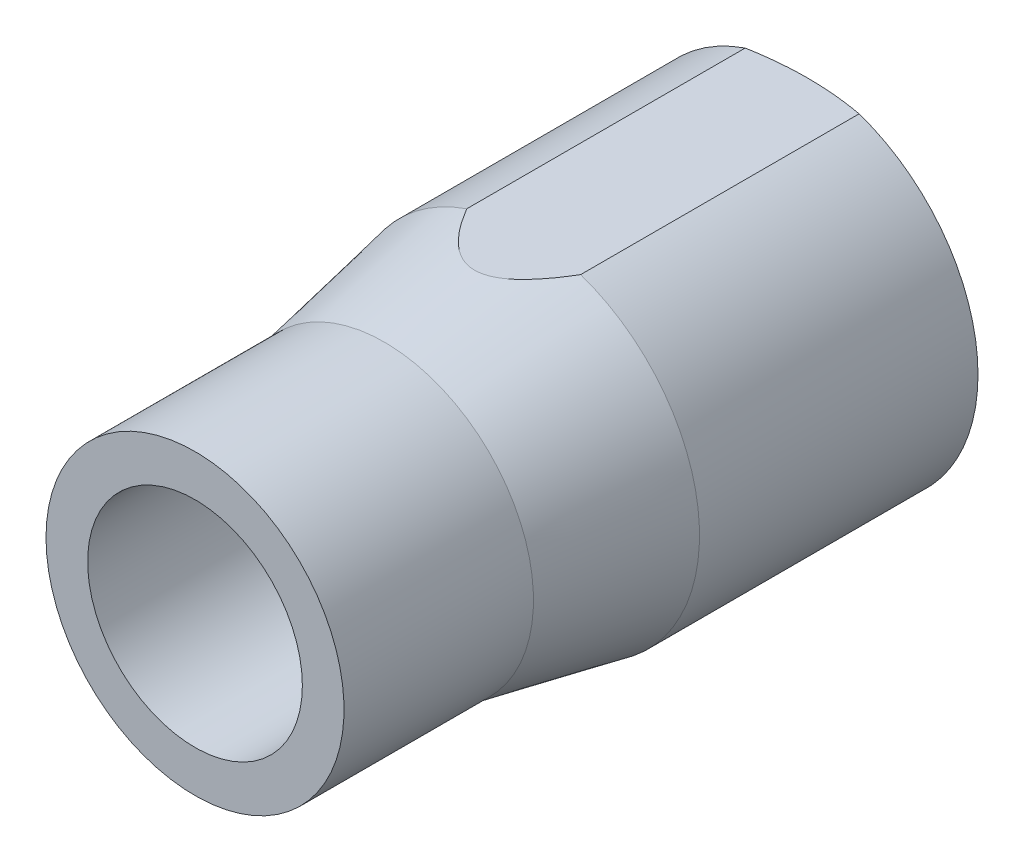
ISO-10303-21;
HEADER;
FILE_DESCRIPTION(('STEP AP214'),'2;1');
FILE_NAME('part.step','',(''),(''),'','','');
FILE_SCHEMA(('AUTOMOTIVE_DESIGN { 1 0 10303 214 1 1 1 1 }'));
ENDSEC;
DATA;
#1=APPLICATION_CONTEXT('core data for automotive mechanical design processes');
#2=APPLICATION_PROTOCOL_DEFINITION('international standard','automotive_design',2000,#1);
#3=PRODUCT_CONTEXT('',#1,'mechanical');
#4=PRODUCT('Part','Part','',(#3));
#5=PRODUCT_RELATED_PRODUCT_CATEGORY('part','',(#4));
#6=PRODUCT_DEFINITION_FORMATION('','',#4);
#7=PRODUCT_DEFINITION_CONTEXT('part definition',#1,'design');
#8=PRODUCT_DEFINITION('design','',#6,#7);
#9=PRODUCT_DEFINITION_SHAPE('','',#8);
#10=(LENGTH_UNIT() NAMED_UNIT(*) SI_UNIT(.MILLI.,.METRE.));
#11=(NAMED_UNIT(*) PLANE_ANGLE_UNIT() SI_UNIT($,.RADIAN.));
#12=(NAMED_UNIT(*) SI_UNIT($,.STERADIAN.) SOLID_ANGLE_UNIT());
#13=UNCERTAINTY_MEASURE_WITH_UNIT(LENGTH_MEASURE(1.E-05),#10,'distance_accuracy_value','');
#14=(GEOMETRIC_REPRESENTATION_CONTEXT(3) GLOBAL_UNCERTAINTY_ASSIGNED_CONTEXT((#13)) GLOBAL_UNIT_ASSIGNED_CONTEXT((#10,
#11,#12)) REPRESENTATION_CONTEXT('',''));
#15=CARTESIAN_POINT('',(0.,0.,0.));
#16=DIRECTION('',(0.,0.,1.));
#17=DIRECTION('',(1.,0.,0.));
#18=AXIS2_PLACEMENT_3D('',#15,#16,#17);
#19=CARTESIAN_POINT('',(0.,0.,13.7795));
#20=DIRECTION('',(0.,0.,-1.));
#21=DIRECTION('',(-1.,0.,0.));
#22=AXIS2_PLACEMENT_3D('',#19,#20,#21);
#23=CYLINDRICAL_SURFACE('',#22,2.06985324725674);
#24=CARTESIAN_POINT('',(0.,0.,0.));
#25=DIRECTION('',(0.,0.,-1.));
#26=DIRECTION('',(-1.,0.,0.));
#27=AXIS2_PLACEMENT_3D('',#24,#25,#26);
#28=CIRCLE('',#27,2.06985324725674);
#29=CARTESIAN_POINT('',(-2.06985324725674,0.,0.));
#30=VERTEX_POINT('',#29);
#31=EDGE_CURVE('E162',#30,#30,#28,.T.);
#32=ORIENTED_EDGE('',*,*,#31,.T.);
#33=EDGE_LOOP('',(#32));
#34=FACE_BOUND('',#33,.T.);
#35=CARTESIAN_POINT('',(0.,0.,11.3284));
#36=DIRECTION('',(0.,0.,1.));
#37=DIRECTION('',(1.,0.,0.));
#38=AXIS2_PLACEMENT_3D('',#35,#36,#37);
#39=CIRCLE('',#38,2.06985324725674);
#40=CARTESIAN_POINT('',(2.06985324725674,0.,11.3284));
#41=VERTEX_POINT('',#40);
#42=EDGE_CURVE('E43',#41,#41,#39,.F.);
#43=ORIENTED_EDGE('',*,*,#42,.F.);
#44=EDGE_LOOP('',(#43));
#45=FACE_BOUND('',#44,.T.);
#46=ADVANCED_FACE('F38',(#34,#45),#23,.F.);
#47=CARTESIAN_POINT('',(0.,0.,9.7155));
#48=DIRECTION('',(0.,0.,-1.));
#49=DIRECTION('',(-1.,0.,0.));
#50=AXIS2_PLACEMENT_3D('',#47,#48,#49);
#51=CYLINDRICAL_SURFACE('',#50,5.2451);
#52=CARTESIAN_POINT('',(0.,0.,9.7155));
#53=DIRECTION('',(0.,0.,-1.));
#54=DIRECTION('',(-1.,0.,0.));
#55=AXIS2_PLACEMENT_3D('',#52,#53,#54);
#56=CIRCLE('',#55,5.2451);
#57=CARTESIAN_POINT('',(1.69954716319891,-4.96211783919553,9.7155));
#58=VERTEX_POINT('',#57);
#59=CARTESIAN_POINT('',(1.69954716319891,4.96211783919554,9.7155));
#60=VERTEX_POINT('',#59);
#61=EDGE_CURVE('E91',#58,#60,#56,.F.);
#62=ORIENTED_EDGE('',*,*,#61,.F.);
#63=DIRECTION('',(0.,0.,-1.));
#64=VECTOR('',#63,1.);
#65=CARTESIAN_POINT('',(1.69954716319891,-4.96211783919553,9.7155));
#66=LINE('',#65,#64);
#67=CARTESIAN_POINT('',(1.69954716319891,-4.96211783919553,1.40794499069004));
#68=VERTEX_POINT('',#67);
#69=EDGE_CURVE('E54',#58,#68,#66,.T.);
#70=ORIENTED_EDGE('',*,*,#69,.T.);
#71=CARTESIAN_POINT('',(0.,0.,1.40794499069004));
#72=DIRECTION('',(0.,0.,1.));
#73=DIRECTION('',(1.,0.,0.));
#74=AXIS2_PLACEMENT_3D('',#71,#72,#73);
#75=CIRCLE('',#74,5.2451);
#76=CARTESIAN_POINT('',(1.69954716319891,4.96211783919553,1.40794499069004));
#77=VERTEX_POINT('',#76);
#78=EDGE_CURVE('E93',#68,#77,#75,.T.);
#79=ORIENTED_EDGE('',*,*,#78,.T.);
#80=DIRECTION('',(0.,0.,-1.));
#81=VECTOR('',#80,1.);
#82=CARTESIAN_POINT('',(1.69954716319891,4.96211783919553,9.7155));
#83=LINE('',#82,#81);
#84=EDGE_CURVE('E79',#77,#60,#83,.F.);
#85=ORIENTED_EDGE('',*,*,#84,.T.);
#86=EDGE_LOOP('',(#62,#70,#79,#85));
#87=FACE_BOUND('',#86,.T.);
#88=ADVANCED_FACE('F90',(#87),#51,.T.);
#89=CARTESIAN_POINT('',(-1.69954716319891,4.96211783919553,1.40794499069004));
#90=VERTEX_POINT('',#89);
#91=CARTESIAN_POINT('',(-1.69954716319891,-4.96211783919553,1.40794499069004));
#92=VERTEX_POINT('',#91);
#93=EDGE_CURVE('E210',#90,#92,#75,.T.);
#94=ORIENTED_EDGE('',*,*,#93,.T.);
#95=DIRECTION('',(0.,0.,-1.));
#96=VECTOR('',#95,1.);
#97=CARTESIAN_POINT('',(-1.69954716319891,-4.96211783919553,9.7155));
#98=LINE('',#97,#96);
#99=CARTESIAN_POINT('',(-1.69954716319891,-4.96211783919553,9.7155));
#100=VERTEX_POINT('',#99);
#101=EDGE_CURVE('E202',#92,#100,#98,.F.);
#102=ORIENTED_EDGE('',*,*,#101,.T.);
#103=CARTESIAN_POINT('',(-1.69954716319891,4.96211783919553,9.7155));
#104=VERTEX_POINT('',#103);
#105=EDGE_CURVE('E97',#104,#100,#56,.F.);
#106=ORIENTED_EDGE('',*,*,#105,.F.);
#107=DIRECTION('',(0.,0.,-1.));
#108=VECTOR('',#107,1.);
#109=CARTESIAN_POINT('',(-1.69954716319891,4.96211783919553,9.7155));
#110=LINE('',#109,#108);
#111=EDGE_CURVE('E62',#104,#90,#110,.T.);
#112=ORIENTED_EDGE('',*,*,#111,.T.);
#113=EDGE_LOOP('',(#94,#102,#106,#112));
#114=FACE_BOUND('',#113,.T.);
#115=ADVANCED_FACE('F182',(#114),#51,.T.);
#116=CARTESIAN_POINT('',(0.,0.,0.));
#117=DIRECTION('',(0.,0.,1.));
#118=DIRECTION('',(1.,0.,0.));
#119=AXIS2_PLACEMENT_3D('',#116,#117,#118);
#120=PLANE('',#119);
#121=ORIENTED_EDGE('',*,*,#31,.F.);
#122=EDGE_LOOP('',(#121));
#123=FACE_BOUND('',#122,.T.);
#124=CARTESIAN_POINT('',(0.,0.,0.));
#125=DIRECTION('',(0.,0.,1.));
#126=DIRECTION('',(1.,0.,0.));
#127=AXIS2_PLACEMENT_3D('',#124,#125,#126);
#128=CIRCLE('',#127,2.70509999999998);
#129=CARTESIAN_POINT('',(2.70509999999998,0.,0.));
#130=VERTEX_POINT('',#129);
#131=EDGE_CURVE('E85',#130,#130,#128,.F.);
#132=ORIENTED_EDGE('',*,*,#131,.T.);
#133=EDGE_LOOP('',(#132));
#134=FACE_BOUND('',#133,.T.);
#135=ADVANCED_FACE('F137',(#123,#134),#120,.F.);
#136=CARTESIAN_POINT('',(0.,0.,1.40794499069004));
#137=DIRECTION('',(0.,0.,1.));
#138=DIRECTION('',(1.,0.,0.));
#139=AXIS2_PLACEMENT_3D('',#136,#137,#138);
#140=CONICAL_SURFACE('',#139,5.2451,1.06465084371654);
#141=CARTESIAN_POINT('',(-7.09579786098608,-4.96211783919553,3.30013036903813));
#142=CARTESIAN_POINT('',(-6.88559882846526,-4.96211783919553,3.20467618797076));
#143=CARTESIAN_POINT('',(-6.6748884827297,-4.96211783919553,3.110325336721));
#144=CARTESIAN_POINT('',(-6.25217843055692,-4.96211783919553,2.92445065350592));
#145=CARTESIAN_POINT('',(-6.04017848676822,-4.96211783919553,2.832927362032));
#146=CARTESIAN_POINT('',(-5.61342540717314,-4.96211783919553,2.65282607124172));
#147=CARTESIAN_POINT('',(-5.39866338385486,-4.96211783919553,2.56426904544449));
#148=CARTESIAN_POINT('',(-4.96737319866934,-4.96211783919553,2.39158081271303));
#149=CARTESIAN_POINT('',(-4.7508451304167,-4.96211783919553,2.30744937292572));
#150=CARTESIAN_POINT('',(-4.31194202712127,-4.96211783919553,2.14335496295021));
#151=CARTESIAN_POINT('',(-4.08953054794927,-4.96211783919553,2.06348886961965));
#152=CARTESIAN_POINT('',(-3.64216471897553,-4.96211783919553,1.91108621532046));
#153=CARTESIAN_POINT('',(-3.41721011305875,-4.96211783919553,1.83855040001918));
#154=CARTESIAN_POINT('',(-2.96499915119287,-4.96211783919553,1.70297541686948));
#155=CARTESIAN_POINT('',(-2.73774940774682,-4.96211783919553,1.63991443865872));
#156=CARTESIAN_POINT('',(-2.28033075864738,-4.96211783919553,1.52550762051938));
#157=CARTESIAN_POINT('',(-2.05016251659149,-4.96211783919553,1.47415916613047));
#158=CARTESIAN_POINT('',(-1.58327907064681,-4.96211783919553,1.38511090233025));
#159=CARTESIAN_POINT('',(-1.3465182086646,-4.96211783919553,1.34764563200111));
#160=CARTESIAN_POINT('',(-0.870837629728315,-4.96211783919553,1.2901610267596));
#161=CARTESIAN_POINT('',(-0.631917937122986,-4.96211783919553,1.27014149533001));
#162=CARTESIAN_POINT('',(-0.155585728478508,-4.96211783919553,1.24932127972494));
#163=CARTESIAN_POINT('',(0.081818389837547,-4.96211783919553,1.24833286315876));
#164=CARTESIAN_POINT('',(0.555961528197617,-4.96211783919553,1.26518595999783));
#165=CARTESIAN_POINT('',(0.792700503360044,-4.96211783919553,1.2830287148571));
#166=CARTESIAN_POINT('',(1.22065762715154,-4.96211783919553,1.33115772843804));
#167=CARTESIAN_POINT('',(1.41221476412732,-4.96211783919553,1.35854035672177));
#168=CARTESIAN_POINT('',(1.79361048695136,-4.96211783919553,1.42352499181565));
#169=CARTESIAN_POINT('',(1.98344871595099,-4.96211783919553,1.46112907253629));
#170=CARTESIAN_POINT('',(2.36133958589128,-4.96211783919553,1.54512982783471));
#171=CARTESIAN_POINT('',(2.54939030533492,-4.96211783919553,1.59153503978262));
#172=CARTESIAN_POINT('',(2.9235041496723,-4.96211783919553,1.69167672903939));
#173=CARTESIAN_POINT('',(3.10956734822116,-4.96211783919553,1.745412933647));
#174=CARTESIAN_POINT('',(3.4840699233908,-4.96211783919553,1.86023956843735));
#175=CARTESIAN_POINT('',(3.67246595496979,-4.96211783919553,1.92147037858621));
#176=CARTESIAN_POINT('',(4.04748794139601,-4.96211783919553,2.04910671903211));
#177=CARTESIAN_POINT('',(4.23411388229998,-4.96211783919553,2.11551229005357));
#178=CARTESIAN_POINT('',(4.6057094035426,-4.96211783919553,2.2525163052896));
#179=CARTESIAN_POINT('',(4.79067975173816,-4.96211783919553,2.32311267602032));
#180=CARTESIAN_POINT('',(5.15925222643651,-4.96211783919553,2.46776408506261));
#181=CARTESIAN_POINT('',(5.34285439097352,-4.96211783919553,2.54181902681006));
#182=CARTESIAN_POINT('',(5.72521900388953,-4.96211783919553,2.69951629849034));
#183=CARTESIAN_POINT('',(5.92387162115017,-4.96211783919553,2.7834243327241));
#184=CARTESIAN_POINT('',(6.31998912996956,-4.96211783919553,2.95400277206625));
#185=CARTESIAN_POINT('',(6.51745399357313,-4.96211783919553,3.04067324189171));
#186=CARTESIAN_POINT('',(7.10837754078732,-4.96211783919553,3.30408419754063));
#187=CARTESIAN_POINT('',(7.50032726082838,-4.96211783919553,3.48420835678527));
#188=CARTESIAN_POINT('',(8.28142867012838,-4.96211783919553,3.8507457955767));
#189=CARTESIAN_POINT('',(8.67057928099176,-4.96211783919553,4.03716135642963));
#190=CARTESIAN_POINT('',(9.44670570049872,-4.96211783919553,4.4144767257985));
#191=CARTESIAN_POINT('',(9.83368146539,-4.96211783919553,4.60537662413047));
#192=CARTESIAN_POINT('',(10.6065478979356,-4.96211783919553,4.99076138800313));
#193=CARTESIAN_POINT('',(10.9924361449953,-4.96211783919553,5.18525109633844));
#194=CARTESIAN_POINT('',(11.7629421656005,-4.96211783919553,5.57673885921379));
#195=CARTESIAN_POINT('',(12.1475599243131,-4.96211783919553,5.77373694290953));
#196=CARTESIAN_POINT('',(12.9157069754536,-4.96211783919553,6.16962264633062));
#197=CARTESIAN_POINT('',(13.2992365012501,-4.96211783919553,6.36850981371171));
#198=CARTESIAN_POINT('',(14.0655000674618,-4.96211783919553,6.76781033597203));
#199=CARTESIAN_POINT('',(14.4482341071602,-4.96211783919553,6.96822369222555));
#200=CARTESIAN_POINT('',(15.4996129779754,-4.96211783919553,7.52089149686744));
#201=CARTESIAN_POINT('',(16.1676004334996,-4.96211783919553,7.87439617292126));
#202=CARTESIAN_POINT('',(17.5022402415939,-4.96211783919553,8.58402327387257));
#203=CARTESIAN_POINT('',(18.1688924991731,-4.96211783919553,8.94014587715074));
#204=CARTESIAN_POINT('',(19.4993845882082,-4.96211783919553,9.65331131933556));
#205=CARTESIAN_POINT('',(20.1632271503874,-4.96211783919553,10.0103490669132));
#206=CARTESIAN_POINT('',(21.490088124718,-4.96211783919553,10.7258321455621));
#207=CARTESIAN_POINT('',(22.1531065958889,-4.96211783919553,11.0842773671528));
#208=CARTESIAN_POINT('',(22.8158545207695,-4.96211783919553,11.4432196832131));
#209=B_SPLINE_CURVE_WITH_KNOTS('',3,(#141,#142,#143,#144,#145,#146,#147,#148,#149,#150,#151,
#152,#153,#154,#155,#156,#157,#158,#159,#160,#161,#162,#163,#164,#165,#166,#167,#168,#169,#170,
#171,#172,#173,#174,#175,#176,#177,#178,#179,#180,#181,#182,#183,#184,#185,#186,#187,#188,#189,
#190,#191,#192,#193,#194,#195,#196,#197,#198,#199,#200,#201,#202,#203,#204,#205,#206,#207,#208),
.UNSPECIFIED.,.F.,.F.,(4,2,2,2,2,2,2,2,2,2,2,2,2,2,2,2,2,2,2,2,2,2,2,2,2,2,2,2,2,2,2,2,2,4),(0.,
0.692582955505739,1.38529749007871,2.08216949860981,2.77900480433116,3.48785425029089,
4.19677573102729,4.90403946697934,5.6111451732429,6.32970392058346,7.04825457362719,
7.7597134138605,8.47121916028946,9.05143593761089,9.63177052764522,10.2126709664347,
10.7935498025424,11.38774833988,11.9819515539225,12.5758631852723,13.169758244373,
13.8166716503479,14.4636002230712,15.757580658851,17.0520354515733,18.3465161928497,
19.6428935759369,20.9392860410391,22.235375538886,23.5314662039639,25.7987361562206,
28.06616205504,30.3274574874189,32.5885803777765),.UNSPECIFIED.);
#210=EDGE_CURVE('E156',#92,#68,#209,.T.);
#211=ORIENTED_EDGE('',*,*,#210,.F.);
#212=ORIENTED_EDGE('',*,*,#93,.F.);
#213=CARTESIAN_POINT('',(-7.09579786098608,4.96211783919553,3.30013036903813));
#214=CARTESIAN_POINT('',(-6.88559882846525,4.96211783919553,3.20467618797076));
#215=CARTESIAN_POINT('',(-6.6748884827297,4.96211783919553,3.110325336721));
#216=CARTESIAN_POINT('',(-6.25217843055692,4.96211783919553,2.92445065350592));
#217=CARTESIAN_POINT('',(-6.04017848676822,4.96211783919553,2.83292736203199));
#218=CARTESIAN_POINT('',(-5.61342540717314,4.96211783919553,2.65282607124172));
#219=CARTESIAN_POINT('',(-5.39866338385485,4.96211783919553,2.56426904544449));
#220=CARTESIAN_POINT('',(-4.96737319866934,4.96211783919553,2.39158081271303));
#221=CARTESIAN_POINT('',(-4.7508451304167,4.96211783919553,2.30744937292572));
#222=CARTESIAN_POINT('',(-4.31194202712127,4.96211783919553,2.14335496295021));
#223=CARTESIAN_POINT('',(-4.08953054794927,4.96211783919553,2.06348886961965));
#224=CARTESIAN_POINT('',(-3.64216471897553,4.96211783919553,1.91108621532046));
#225=CARTESIAN_POINT('',(-3.41721011305875,4.96211783919553,1.83855040001918));
#226=CARTESIAN_POINT('',(-2.96499915119287,4.96211783919553,1.70297541686948));
#227=CARTESIAN_POINT('',(-2.73774940774682,4.96211783919553,1.63991443865872));
#228=CARTESIAN_POINT('',(-2.28033075864738,4.96211783919553,1.52550762051938));
#229=CARTESIAN_POINT('',(-2.05016251659149,4.96211783919553,1.47415916613047));
#230=CARTESIAN_POINT('',(-1.58327907064681,4.96211783919553,1.38511090233025));
#231=CARTESIAN_POINT('',(-1.3465182086646,4.96211783919553,1.34764563200111));
#232=CARTESIAN_POINT('',(-0.870837629728314,4.96211783919553,1.2901610267596));
#233=CARTESIAN_POINT('',(-0.631917937122985,4.96211783919553,1.27014149533001));
#234=CARTESIAN_POINT('',(-0.155585728478507,4.96211783919553,1.24932127972494));
#235=CARTESIAN_POINT('',(0.0818183898375474,4.96211783919553,1.24833286315876));
#236=CARTESIAN_POINT('',(0.555961528197618,4.96211783919553,1.26518595999783));
#237=CARTESIAN_POINT('',(0.792700503360044,4.96211783919553,1.28302871485711));
#238=CARTESIAN_POINT('',(1.22065762715154,4.96211783919553,1.33115772843804));
#239=CARTESIAN_POINT('',(1.41221476412732,4.96211783919553,1.35854035672177));
#240=CARTESIAN_POINT('',(1.79361048695136,4.96211783919553,1.42352499181565));
#241=CARTESIAN_POINT('',(1.98344871595099,4.96211783919554,1.46112907253629));
#242=CARTESIAN_POINT('',(2.36133958589128,4.96211783919554,1.54512982783471));
#243=CARTESIAN_POINT('',(2.54939030533492,4.96211783919554,1.59153503978262));
#244=CARTESIAN_POINT('',(2.9235041496723,4.96211783919554,1.69167672903939));
#245=CARTESIAN_POINT('',(3.10956734822116,4.96211783919554,1.745412933647));
#246=CARTESIAN_POINT('',(3.4840699233908,4.96211783919554,1.86023956843735));
#247=CARTESIAN_POINT('',(3.67246595496979,4.96211783919554,1.92147037858621));
#248=CARTESIAN_POINT('',(4.047487941396,4.96211783919554,2.04910671903211));
#249=CARTESIAN_POINT('',(4.23411388229998,4.96211783919554,2.11551229005357));
#250=CARTESIAN_POINT('',(4.6057094035426,4.96211783919554,2.2525163052896));
#251=CARTESIAN_POINT('',(4.79067975173817,4.96211783919554,2.32311267602033));
#252=CARTESIAN_POINT('',(5.15925222643651,4.96211783919554,2.46776408506261));
#253=CARTESIAN_POINT('',(5.34285439097352,4.96211783919554,2.54181902681006));
#254=CARTESIAN_POINT('',(5.72521900388953,4.96211783919554,2.69951629849034));
#255=CARTESIAN_POINT('',(5.92387162115017,4.96211783919554,2.7834243327241));
#256=CARTESIAN_POINT('',(6.31998912996956,4.96211783919554,2.95400277206625));
#257=CARTESIAN_POINT('',(6.51745399357313,4.96211783919554,3.04067324189171));
#258=CARTESIAN_POINT('',(7.10837754078732,4.96211783919554,3.30408419754063));
#259=CARTESIAN_POINT('',(7.50032726082838,4.96211783919554,3.48420835678527));
#260=CARTESIAN_POINT('',(8.28142867012838,4.96211783919554,3.8507457955767));
#261=CARTESIAN_POINT('',(8.67057928099176,4.96211783919554,4.03716135642963));
#262=CARTESIAN_POINT('',(9.44670570049873,4.96211783919554,4.41447672579851));
#263=CARTESIAN_POINT('',(9.83368146539001,4.96211783919554,4.60537662413047));
#264=CARTESIAN_POINT('',(10.6065478979356,4.96211783919554,4.99076138800314));
#265=CARTESIAN_POINT('',(10.9924361449953,4.96211783919554,5.18525109633845));
#266=CARTESIAN_POINT('',(11.7629421656005,4.96211783919554,5.5767388592138));
#267=CARTESIAN_POINT('',(12.1475599243131,4.96211783919554,5.77373694290953));
#268=CARTESIAN_POINT('',(12.9157069754536,4.96211783919554,6.16962264633063));
#269=CARTESIAN_POINT('',(13.2992365012501,4.96211783919554,6.36850981371172));
#270=CARTESIAN_POINT('',(14.0655000674618,4.96211783919554,6.76781033597204));
#271=CARTESIAN_POINT('',(14.4482341071602,4.96211783919554,6.96822369222556));
#272=CARTESIAN_POINT('',(15.4996129779754,4.96211783919554,7.52089149686745));
#273=CARTESIAN_POINT('',(16.1676004334996,4.96211783919554,7.87439617292127));
#274=CARTESIAN_POINT('',(17.5022402415939,4.96211783919554,8.58402327387257));
#275=CARTESIAN_POINT('',(18.1688924991731,4.96211783919554,8.94014587715074));
#276=CARTESIAN_POINT('',(19.4993845882083,4.96211783919554,9.65331131933556));
#277=CARTESIAN_POINT('',(20.1632271503874,4.96211783919554,10.0103490669132));
#278=CARTESIAN_POINT('',(21.490088124718,4.96211783919554,10.7258321455621));
#279=CARTESIAN_POINT('',(22.1531065958889,4.96211783919554,11.0842773671528));
#280=CARTESIAN_POINT('',(22.8158545207695,4.96211783919554,11.4432196832131));
#281=B_SPLINE_CURVE_WITH_KNOTS('',3,(#213,#214,#215,#216,#217,#218,#219,#220,#221,#222,#223,
#224,#225,#226,#227,#228,#229,#230,#231,#232,#233,#234,#235,#236,#237,#238,#239,#240,#241,#242,
#243,#244,#245,#246,#247,#248,#249,#250,#251,#252,#253,#254,#255,#256,#257,#258,#259,#260,#261,
#262,#263,#264,#265,#266,#267,#268,#269,#270,#271,#272,#273,#274,#275,#276,#277,#278,#279,#280),
.UNSPECIFIED.,.F.,.F.,(4,2,2,2,2,2,2,2,2,2,2,2,2,2,2,2,2,2,2,2,2,2,2,2,2,2,2,2,2,2,2,2,2,4),(0.,
0.692582955505739,1.38529749007871,2.08216949860981,2.77900480433116,3.48785425029089,
4.19677573102729,4.90403946697934,5.61114517324289,6.32970392058346,7.04825457362719,
7.7597134138605,8.47121916028946,9.05143593761089,9.63177052764522,10.2126709664347,
10.7935498025424,11.38774833988,11.9819515539225,12.5758631852723,13.169758244373,
13.8166716503479,14.4636002230712,15.757580658851,17.0520354515733,18.3465161928497,
19.6428935759369,20.9392860410392,22.235375538886,23.5314662039639,25.7987361562206,
28.06616205504,30.3274574874189,32.5885803777765),.UNSPECIFIED.);
#282=EDGE_CURVE('E198',#77,#90,#281,.F.);
#283=ORIENTED_EDGE('',*,*,#282,.F.);
#284=ORIENTED_EDGE('',*,*,#78,.F.);
#285=EDGE_LOOP('',(#211,#212,#283,#284));
#286=FACE_BOUND('',#285,.T.);
#287=ORIENTED_EDGE('',*,*,#131,.F.);
#288=EDGE_LOOP('',(#287));
#289=FACE_BOUND('',#288,.T.);
#290=ADVANCED_FACE('F40',(#286,#289),#140,.T.);
#291=CARTESIAN_POINT('',(0.,0.,13.8684));
#292=DIRECTION('',(0.,0.,-1.));
#293=DIRECTION('',(-1.,0.,0.));
#294=AXIS2_PLACEMENT_3D('',#291,#292,#293);
#295=CONICAL_SURFACE('',#294,4.445,0.190328539691908);
#296=CARTESIAN_POINT('',(-5.30348319142398,-4.96211783919553,-0.757782469285062));
#297=CARTESIAN_POINT('',(-5.21528122274595,-4.96211783919553,-0.423539434661935));
#298=CARTESIAN_POINT('',(-5.1261459474942,-4.96211783919553,-0.0895399339343389));
#299=CARTESIAN_POINT('',(-4.94563650517196,-4.96211783919553,0.577871485225516));
#300=CARTESIAN_POINT('',(-4.8542622233082,-4.96211783919553,0.911283372587654));
#301=CARTESIAN_POINT('',(-4.66861932648691,-4.96211783919553,1.57843459146346));
#302=CARTESIAN_POINT('',(-4.57434249546768,-4.96211783919553,1.91217164188225));
#303=CARTESIAN_POINT('',(-4.38267078558048,-4.96211783919553,2.57874131068317));
#304=CARTESIAN_POINT('',(-4.28527598805144,-4.96211783919553,2.91157395241341));
#305=CARTESIAN_POINT('',(-4.07604184525909,-4.96211783919553,3.61185147962157));
#306=CARTESIAN_POINT('',(-3.96377551538999,-4.96211783919553,3.97916925969729));
#307=CARTESIAN_POINT('',(-3.73340292881624,-4.96211783919553,4.71201119914735));
#308=CARTESIAN_POINT('',(-3.61529618887078,-4.96211783919553,5.07753520734363));
#309=CARTESIAN_POINT('',(-3.37173346912538,-4.96211783919553,5.80530358466926));
#310=CARTESIAN_POINT('',(-3.24629314299393,-4.96211783919553,6.16755316166722));
#311=CARTESIAN_POINT('',(-2.98518534020397,-4.96211783919553,6.88830923303512));
#312=CARTESIAN_POINT('',(-2.8495198933813,-4.96211783919553,7.24681645431356));
#313=CARTESIAN_POINT('',(-2.59989904399845,-4.96211783919553,7.86722337987099));
#314=CARTESIAN_POINT('',(-2.48923720936631,-4.96211783919553,8.13043156619199));
#315=CARTESIAN_POINT('',(-2.31443035641554,-4.96211783919553,8.52181678411444));
#316=CARTESIAN_POINT('',(-2.25458926456027,-4.96211783919553,8.65191330353015));
#317=CARTESIAN_POINT('',(-2.13138889487573,-4.96211783919553,8.91041524643025));
#318=CARTESIAN_POINT('',(-2.0680301566096,-4.96211783919553,9.03882092555079));
#319=CARTESIAN_POINT('',(-1.93845383360762,-4.96211783919553,9.29051749304559));
#320=CARTESIAN_POINT('',(-1.87233377226304,-4.96211783919553,9.41385832356683));
#321=CARTESIAN_POINT('',(-1.73487780479187,-4.96211783919553,9.65759186439487));
#322=CARTESIAN_POINT('',(-1.66354317668832,-4.96211783919553,9.77798528748139));
#323=CARTESIAN_POINT('',(-1.51444282105319,-4.96211783919553,10.013986842759));
#324=CARTESIAN_POINT('',(-1.43670781449909,-4.96211783919553,10.1296142465466));
#325=CARTESIAN_POINT('',(-1.272348078764,-4.96211783919553,10.3543072127159));
#326=CARTESIAN_POINT('',(-1.18573798385995,-4.96211783919553,10.4633831213989));
#327=CARTESIAN_POINT('',(-1.06102506382159,-4.96211783919553,10.6025898557593));
#328=CARTESIAN_POINT('',(-1.02835758496353,-4.96211783919553,10.6375844643351));
#329=CARTESIAN_POINT('',(-0.961355737190032,-4.96211783919553,10.7059516618573));
#330=CARTESIAN_POINT('',(-0.927020813366518,-4.96211783919553,10.7393237033337));
#331=CARTESIAN_POINT('',(-0.821277381059618,-4.96211783919553,10.8364190398991));
#332=CARTESIAN_POINT('',(-0.747047209021879,-4.96211783919553,10.8972171931812));
#333=CARTESIAN_POINT('',(-0.610564212605158,-4.96211783919553,10.9917714040531));
#334=CARTESIAN_POINT('',(-0.550344306383392,-4.96211783919553,11.0284251812792));
#335=CARTESIAN_POINT('',(-0.424932019451822,-4.96211783919553,11.0920626244741));
#336=CARTESIAN_POINT('',(-0.35974813542403,-4.96211783919553,11.1190623828887));
#337=CARTESIAN_POINT('',(-0.239279313440202,-4.96211783919553,11.1558611188997));
#338=CARTESIAN_POINT('',(-0.184740386099656,-4.96211783919553,11.1680644596746));
#339=CARTESIAN_POINT('',(-0.0743925766619826,-4.96211783919553,11.1830028368192));
#340=CARTESIAN_POINT('',(-0.01858509460297,-4.96211783919553,11.1857478454814));
#341=CARTESIAN_POINT('',(0.0926578419310682,-4.96211783919553,11.1814416922077));
#342=CARTESIAN_POINT('',(0.148093160101596,-4.96211783919553,11.1743871189549));
#343=CARTESIAN_POINT('',(0.257059745375393,-4.96211783919553,11.1513293274168));
#344=CARTESIAN_POINT('',(0.310589137939268,-4.96211783919553,11.1353175446622));
#345=CARTESIAN_POINT('',(0.437296340333481,-4.96211783919553,11.0873772881909));
#346=CARTESIAN_POINT('',(0.50898432814111,-4.96211783919553,11.0515619250431));
#347=CARTESIAN_POINT('',(0.646018413958224,-4.96211783919553,10.96937984517));
#348=CARTESIAN_POINT('',(0.711345703134194,-4.96211783919553,10.922983114837));
#349=CARTESIAN_POINT('',(0.833919240312389,-4.96211783919553,10.8249489968662));
#350=CARTESIAN_POINT('',(0.891374556795029,-4.96211783919553,10.7735677081039));
#351=CARTESIAN_POINT('',(1.00181003047322,-4.96211783919553,10.66615905147));
#352=CARTESIAN_POINT('',(1.05478552767089,-4.96211783919553,10.6101269628981));
#353=CARTESIAN_POINT('',(1.15739008973937,-4.96211783919553,10.494278024652));
#354=CARTESIAN_POINT('',(1.20698772300325,-4.96211783919553,10.4344336169607));
#355=CARTESIAN_POINT('',(1.30295612978848,-4.96211783919553,10.3122899729025));
#356=CARTESIAN_POINT('',(1.349328789903,-4.96211783919553,10.2499922057251));
#357=CARTESIAN_POINT('',(1.48490166423179,-4.96211783919553,10.0596608529955));
#358=CARTESIAN_POINT('',(1.57007160291713,-4.96211783919553,9.92876200288254));
#359=CARTESIAN_POINT('',(1.73267973193721,-4.96211783919553,9.66221089005155));
#360=CARTESIAN_POINT('',(1.810111678761,-4.96211783919553,9.52655490629766));
#361=CARTESIAN_POINT('',(1.95933064756798,-4.96211783919553,9.25155818609914));
#362=CARTESIAN_POINT('',(2.0310963003272,-4.96211783919553,9.11220592345443));
#363=CARTESIAN_POINT('',(2.16997350514139,-4.96211783919553,8.83119805089943));
#364=CARTESIAN_POINT('',(2.23708447745845,-4.96211783919553,8.68954215677575));
#365=CARTESIAN_POINT('',(2.3623452832769,-4.96211783919553,8.41589541142691));
#366=CARTESIAN_POINT('',(2.42078281872458,-4.96211783919553,8.28403559362669));
#367=CARTESIAN_POINT('',(2.53500768163008,-4.96211783919553,8.01915972268481));
#368=CARTESIAN_POINT('',(2.59079472690101,-4.96211783919553,7.88614354820604));
#369=CARTESIAN_POINT('',(2.69965196451792,-4.96211783919553,7.62033366531996));
#370=CARTESIAN_POINT('',(2.75274130038708,-4.96211783919553,7.48754777003574));
#371=CARTESIAN_POINT('',(2.85699298014896,-4.96211783919553,7.22125431585405));
#372=CARTESIAN_POINT('',(2.90815574297035,-4.96211783919553,7.08774692114975));
#373=CARTESIAN_POINT('',(2.95850895458644,-4.96211783919553,6.95394013306512));
#374=B_SPLINE_CURVE_WITH_KNOTS('',3,(#296,#297,#298,#299,#300,#301,#302,#303,#304,#305,#306,
#307,#308,#309,#310,#311,#312,#313,#314,#315,#316,#317,#318,#319,#320,#321,#322,#323,#324,#325,
#326,#327,#328,#329,#330,#331,#332,#333,#334,#335,#336,#337,#338,#339,#340,#341,#342,#343,#344,
#345,#346,#347,#348,#349,#350,#351,#352,#353,#354,#355,#356,#357,#358,#359,#360,#361,#362,#363,
#364,#365,#366,#367,#368,#369,#370,#371,#372,#373),.UNSPECIFIED.,.F.,.F.,(4,2,2,2,2,2,2,2,2,2,2,
2,2,2,2,2,2,2,2,2,2,2,2,2,2,2,2,2,2,2,2,2,2,2,2,2,2,2,4),(0.,1.03705705082304,2.0741673829951,
3.11454710601995,4.15489971056627,5.30713594178204,6.45946767010976,7.60942367797228,
8.75915200100459,9.61550637041633,10.0450641303066,10.4745561824516,10.894300303804,
11.3139418939884,11.7316751421044,12.1487303409343,12.2922955098199,12.4359087875261,
12.7227569907056,12.9336522873714,13.1441943819906,13.3111292835107,13.4778881250382,
13.6447050312691,13.8116817134035,14.0507173620873,14.2904396491348,14.5213287930261,
14.7524552314549,14.9855003877655,15.2184080466352,15.6864670029817,16.1549006208607,
16.6250239207586,17.0952056694966,17.5278584360158,17.9605571625625,18.3895581303001,
18.8184652676906),.UNSPECIFIED.);
#375=EDGE_CURVE('E13',#58,#100,#374,.F.);
#376=ORIENTED_EDGE('',*,*,#375,.F.);
#377=ORIENTED_EDGE('',*,*,#61,.T.);
#378=CARTESIAN_POINT('',(-5.30348319142397,4.96211783919553,-0.757782469285053));
#379=CARTESIAN_POINT('',(-5.21528122274595,4.96211783919553,-0.423539434661928));
#380=CARTESIAN_POINT('',(-5.12614594749419,4.96211783919553,-0.0895399339343321));
#381=CARTESIAN_POINT('',(-4.94563650517196,4.96211783919553,0.577871485225521));
#382=CARTESIAN_POINT('',(-4.8542622233082,4.96211783919553,0.911283372587657));
#383=CARTESIAN_POINT('',(-4.66861932648691,4.96211783919553,1.57843459146346));
#384=CARTESIAN_POINT('',(-4.57434249546768,4.96211783919553,1.91217164188225));
#385=CARTESIAN_POINT('',(-4.38267078558048,4.96211783919553,2.57874131068317));
#386=CARTESIAN_POINT('',(-4.28527598805144,4.96211783919553,2.91157395241341));
#387=CARTESIAN_POINT('',(-4.07604184525909,4.96211783919553,3.61185147962157));
#388=CARTESIAN_POINT('',(-3.96377551538999,4.96211783919553,3.97916925969729));
#389=CARTESIAN_POINT('',(-3.73340292881625,4.96211783919553,4.71201119914735));
#390=CARTESIAN_POINT('',(-3.61529618887078,4.96211783919553,5.07753520734363));
#391=CARTESIAN_POINT('',(-3.37173346912538,4.96211783919553,5.80530358466926));
#392=CARTESIAN_POINT('',(-3.24629314299393,4.96211783919553,6.16755316166722));
#393=CARTESIAN_POINT('',(-2.98518534020397,4.96211783919553,6.88830923303511));
#394=CARTESIAN_POINT('',(-2.8495198933813,4.96211783919553,7.24681645431356));
#395=CARTESIAN_POINT('',(-2.59989904399845,4.96211783919553,7.86722337987099));
#396=CARTESIAN_POINT('',(-2.48923720936632,4.96211783919553,8.13043156619199));
#397=CARTESIAN_POINT('',(-2.31443035641554,4.96211783919553,8.52181678411444));
#398=CARTESIAN_POINT('',(-2.25458926456027,4.96211783919553,8.65191330353015));
#399=CARTESIAN_POINT('',(-2.13138889487573,4.96211783919553,8.91041524643025));
#400=CARTESIAN_POINT('',(-2.0680301566096,4.96211783919553,9.0388209255508));
#401=CARTESIAN_POINT('',(-1.93845383360762,4.96211783919553,9.29051749304559));
#402=CARTESIAN_POINT('',(-1.87233377226304,4.96211783919553,9.41385832356683));
#403=CARTESIAN_POINT('',(-1.73487780479187,4.96211783919553,9.65759186439487));
#404=CARTESIAN_POINT('',(-1.66354317668833,4.96211783919553,9.77798528748139));
#405=CARTESIAN_POINT('',(-1.51444282105319,4.96211783919553,10.0139868427589));
#406=CARTESIAN_POINT('',(-1.43670781449909,4.96211783919553,10.1296142465466));
#407=CARTESIAN_POINT('',(-1.272348078764,4.96211783919553,10.3543072127159));
#408=CARTESIAN_POINT('',(-1.18573798385995,4.96211783919553,10.4633831213989));
#409=CARTESIAN_POINT('',(-1.06102506382159,4.96211783919553,10.6025898557593));
#410=CARTESIAN_POINT('',(-1.02835758496353,4.96211783919553,10.6375844643351));
#411=CARTESIAN_POINT('',(-0.961355737190033,4.96211783919553,10.7059516618573));
#412=CARTESIAN_POINT('',(-0.927020813366519,4.96211783919553,10.7393237033337));
#413=CARTESIAN_POINT('',(-0.82127738105962,4.96211783919553,10.8364190398991));
#414=CARTESIAN_POINT('',(-0.747047209021879,4.96211783919553,10.8972171931812));
#415=CARTESIAN_POINT('',(-0.610564212605157,4.96211783919553,10.9917714040531));
#416=CARTESIAN_POINT('',(-0.550344306383392,4.96211783919553,11.0284251812792));
#417=CARTESIAN_POINT('',(-0.424932019451822,4.96211783919553,11.0920626244741));
#418=CARTESIAN_POINT('',(-0.35974813542403,4.96211783919553,11.1190623828887));
#419=CARTESIAN_POINT('',(-0.239279313440202,4.96211783919553,11.1558611188997));
#420=CARTESIAN_POINT('',(-0.184740386099656,4.96211783919553,11.1680644596746));
#421=CARTESIAN_POINT('',(-0.0743925766619821,4.96211783919553,11.1830028368192));
#422=CARTESIAN_POINT('',(-0.018585094602969,4.96211783919553,11.1857478454814));
#423=CARTESIAN_POINT('',(0.0926578419310702,4.96211783919553,11.1814416922077));
#424=CARTESIAN_POINT('',(0.148093160101599,4.96211783919553,11.1743871189549));
#425=CARTESIAN_POINT('',(0.257059745375395,4.96211783919553,11.1513293274168));
#426=CARTESIAN_POINT('',(0.310589137939271,4.96211783919553,11.1353175446622));
#427=CARTESIAN_POINT('',(0.437296340333484,4.96211783919553,11.0873772881909));
#428=CARTESIAN_POINT('',(0.508984328141113,4.96211783919553,11.0515619250431));
#429=CARTESIAN_POINT('',(0.646018413958227,4.96211783919553,10.96937984517));
#430=CARTESIAN_POINT('',(0.711345703134196,4.96211783919553,10.922983114837));
#431=CARTESIAN_POINT('',(0.833919240312391,4.96211783919553,10.8249489968662));
#432=CARTESIAN_POINT('',(0.891374556795032,4.96211783919553,10.7735677081039));
#433=CARTESIAN_POINT('',(1.00181003047322,4.96211783919553,10.66615905147));
#434=CARTESIAN_POINT('',(1.0547855276709,4.96211783919553,10.6101269628981));
#435=CARTESIAN_POINT('',(1.15739008973937,4.96211783919553,10.494278024652));
#436=CARTESIAN_POINT('',(1.20698772300325,4.96211783919553,10.4344336169607));
#437=CARTESIAN_POINT('',(1.30295612978848,4.96211783919553,10.3122899729025));
#438=CARTESIAN_POINT('',(1.349328789903,4.96211783919553,10.2499922057251));
#439=CARTESIAN_POINT('',(1.48490166423179,4.96211783919553,10.0596608529955));
#440=CARTESIAN_POINT('',(1.57007160291713,4.96211783919553,9.92876200288253));
#441=CARTESIAN_POINT('',(1.73267973193721,4.96211783919553,9.66221089005155));
#442=CARTESIAN_POINT('',(1.810111678761,4.96211783919554,9.52655490629765));
#443=CARTESIAN_POINT('',(1.95933064756798,4.96211783919554,9.25155818609914));
#444=CARTESIAN_POINT('',(2.0310963003272,4.96211783919554,9.11220592345442));
#445=CARTESIAN_POINT('',(2.16997350514139,4.96211783919554,8.83119805089942));
#446=CARTESIAN_POINT('',(2.23708447745846,4.96211783919554,8.68954215677574));
#447=CARTESIAN_POINT('',(2.3623452832769,4.96211783919554,8.41589541142689));
#448=CARTESIAN_POINT('',(2.42078281872459,4.96211783919554,8.28403559362667));
#449=CARTESIAN_POINT('',(2.53500768163009,4.96211783919554,8.01915972268479));
#450=CARTESIAN_POINT('',(2.59079472690102,4.96211783919554,7.88614354820602));
#451=CARTESIAN_POINT('',(2.69965196451793,4.96211783919554,7.62033366531994));
#452=CARTESIAN_POINT('',(2.75274130038709,4.96211783919554,7.48754777003572));
#453=CARTESIAN_POINT('',(2.85699298014897,4.96211783919554,7.22125431585402));
#454=CARTESIAN_POINT('',(2.90815574297036,4.96211783919554,7.08774692114972));
#455=CARTESIAN_POINT('',(2.95850895458645,4.96211783919554,6.95394013306509));
#456=B_SPLINE_CURVE_WITH_KNOTS('',3,(#378,#379,#380,#381,#382,#383,#384,#385,#386,#387,#388,
#389,#390,#391,#392,#393,#394,#395,#396,#397,#398,#399,#400,#401,#402,#403,#404,#405,#406,#407,
#408,#409,#410,#411,#412,#413,#414,#415,#416,#417,#418,#419,#420,#421,#422,#423,#424,#425,#426,
#427,#428,#429,#430,#431,#432,#433,#434,#435,#436,#437,#438,#439,#440,#441,#442,#443,#444,#445,
#446,#447,#448,#449,#450,#451,#452,#453,#454,#455),.UNSPECIFIED.,.F.,.F.,(4,2,2,2,2,2,2,2,2,2,2,
2,2,2,2,2,2,2,2,2,2,2,2,2,2,2,2,2,2,2,2,2,2,2,2,2,2,2,4),(0.,1.03705705082304,2.07416738299509,
3.11454710601994,4.15489971056626,5.30713594178203,6.45946767010975,7.60942367797227,
8.75915200100459,9.61550637041632,10.0450641303066,10.4745561824516,10.894300303804,
11.3139418939884,11.7316751421043,12.1487303409343,12.2922955098199,12.4359087875261,
12.7227569907056,12.9336522873714,13.1441943819906,13.3111292835107,13.4778881250382,
13.6447050312691,13.8116817134035,14.0507173620873,14.2904396491348,14.5213287930261,
14.7524552314549,14.9855003877655,15.2184080466352,15.6864670029817,16.1549006208608,
16.6250239207586,17.0952056694966,17.5278584360159,17.9605571625625,18.3895581303001,
18.8184652676907),.UNSPECIFIED.);
#457=EDGE_CURVE('E48',#104,#60,#456,.T.);
#458=ORIENTED_EDGE('',*,*,#457,.F.);
#459=ORIENTED_EDGE('',*,*,#105,.T.);
#460=EDGE_LOOP('',(#376,#377,#458,#459));
#461=FACE_BOUND('',#460,.T.);
#462=CARTESIAN_POINT('',(0.,0.,13.8684));
#463=DIRECTION('',(0.,0.,1.));
#464=DIRECTION('',(1.,0.,0.));
#465=AXIS2_PLACEMENT_3D('',#462,#463,#464);
#466=CIRCLE('',#465,4.445);
#467=CARTESIAN_POINT('',(-4.445,0.,13.8684));
#468=VERTEX_POINT('',#467);
#469=EDGE_CURVE('E98',#468,#468,#466,.T.);
#470=ORIENTED_EDGE('',*,*,#469,.F.);
#471=EDGE_LOOP('',(#470));
#472=FACE_BOUND('',#471,.T.);
#473=ADVANCED_FACE('F95',(#461,#472),#295,.T.);
#474=CARTESIAN_POINT('',(0.,0.,19.5199));
#475=DIRECTION('',(0.,0.,-1.));
#476=DIRECTION('',(-1.,0.,0.));
#477=AXIS2_PLACEMENT_3D('',#474,#475,#476);
#478=CYLINDRICAL_SURFACE('',#477,4.445);
#479=CARTESIAN_POINT('',(0.,0.,19.5199));
#480=DIRECTION('',(0.,0.,1.));
#481=DIRECTION('',(1.,0.,0.));
#482=AXIS2_PLACEMENT_3D('',#479,#480,#481);
#483=CIRCLE('',#482,4.445);
#484=CARTESIAN_POINT('',(-4.445,0.,19.5199));
#485=VERTEX_POINT('',#484);
#486=EDGE_CURVE('E102',#485,#485,#483,.T.);
#487=CARTESIAN_POINT('',(-4.445,0.,19.5199));
#488=CARTESIAN_POINT('',(-4.445,0.,19.4610302083333));
#489=CARTESIAN_POINT('',(-4.445,0.,19.4021604166667));
#490=CARTESIAN_POINT('',(-4.445,0.,19.2844208333333));
#491=CARTESIAN_POINT('',(-4.445,0.,19.2255510416667));
#492=CARTESIAN_POINT('',(-4.445,0.,19.1078114583333));
#493=CARTESIAN_POINT('',(-4.445,0.,19.0489416666667));
#494=CARTESIAN_POINT('',(-4.445,0.,18.9312020833333));
#495=CARTESIAN_POINT('',(-4.445,0.,18.8723322916667));
#496=CARTESIAN_POINT('',(-4.445,0.,18.7545927083333));
#497=CARTESIAN_POINT('',(-4.445,0.,18.6957229166667));
#498=CARTESIAN_POINT('',(-4.445,0.,18.5779833333333));
#499=CARTESIAN_POINT('',(-4.445,0.,18.5191135416667));
#500=CARTESIAN_POINT('',(-4.445,0.,18.4013739583333));
#501=CARTESIAN_POINT('',(-4.445,0.,18.3425041666667));
#502=CARTESIAN_POINT('',(-4.445,0.,18.2247645833333));
#503=CARTESIAN_POINT('',(-4.445,0.,18.1658947916667));
#504=CARTESIAN_POINT('',(-4.445,0.,18.0481552083333));
#505=CARTESIAN_POINT('',(-4.445,0.,17.9892854166667));
#506=CARTESIAN_POINT('',(-4.445,0.,17.8715458333333));
#507=CARTESIAN_POINT('',(-4.445,0.,17.8126760416667));
#508=CARTESIAN_POINT('',(-4.445,0.,17.6949364583333));
#509=CARTESIAN_POINT('',(-4.445,0.,17.6360666666667));
#510=CARTESIAN_POINT('',(-4.445,0.,17.5183270833333));
#511=CARTESIAN_POINT('',(-4.445,0.,17.4594572916667));
#512=CARTESIAN_POINT('',(-4.445,0.,17.3417177083333));
#513=CARTESIAN_POINT('',(-4.445,0.,17.2828479166667));
#514=CARTESIAN_POINT('',(-4.445,0.,17.1651083333333));
#515=CARTESIAN_POINT('',(-4.445,0.,17.1062385416667));
#516=CARTESIAN_POINT('',(-4.445,0.,16.9884989583333));
#517=CARTESIAN_POINT('',(-4.445,0.,16.9296291666667));
#518=CARTESIAN_POINT('',(-4.445,0.,16.8118895833333));
#519=CARTESIAN_POINT('',(-4.445,0.,16.7530197916667));
#520=CARTESIAN_POINT('',(-4.445,0.,16.6352802083333));
#521=CARTESIAN_POINT('',(-4.445,0.,16.5764104166667));
#522=CARTESIAN_POINT('',(-4.445,0.,16.4586708333333));
#523=CARTESIAN_POINT('',(-4.445,0.,16.3998010416667));
#524=CARTESIAN_POINT('',(-4.445,0.,16.2820614583333));
#525=CARTESIAN_POINT('',(-4.445,0.,16.2231916666667));
#526=CARTESIAN_POINT('',(-4.445,0.,16.1054520833333));
#527=CARTESIAN_POINT('',(-4.445,0.,16.0465822916667));
#528=CARTESIAN_POINT('',(-4.445,0.,15.9288427083333));
#529=CARTESIAN_POINT('',(-4.445,0.,15.8699729166667));
#530=CARTESIAN_POINT('',(-4.445,0.,15.7522333333333));
#531=CARTESIAN_POINT('',(-4.445,0.,15.6933635416667));
#532=CARTESIAN_POINT('',(-4.445,0.,15.5756239583333));
#533=CARTESIAN_POINT('',(-4.445,0.,15.5167541666667));
#534=CARTESIAN_POINT('',(-4.445,0.,15.3990145833333));
#535=CARTESIAN_POINT('',(-4.445,0.,15.3401447916667));
#536=CARTESIAN_POINT('',(-4.445,0.,15.2224052083333));
#537=CARTESIAN_POINT('',(-4.445,0.,15.1635354166667));
#538=CARTESIAN_POINT('',(-4.445,0.,15.0457958333333));
#539=CARTESIAN_POINT('',(-4.445,0.,14.9869260416667));
#540=CARTESIAN_POINT('',(-4.445,0.,14.8691864583333));
#541=CARTESIAN_POINT('',(-4.445,0.,14.8103166666667));
#542=CARTESIAN_POINT('',(-4.445,0.,14.6925770833333));
#543=CARTESIAN_POINT('',(-4.445,0.,14.6337072916667));
#544=CARTESIAN_POINT('',(-4.445,0.,14.5159677083333));
#545=CARTESIAN_POINT('',(-4.445,0.,14.4570979166667));
#546=CARTESIAN_POINT('',(-4.445,0.,14.3393583333333));
#547=CARTESIAN_POINT('',(-4.445,0.,14.2804885416667));
#548=CARTESIAN_POINT('',(-4.445,0.,14.1627489583333));
#549=CARTESIAN_POINT('',(-4.445,0.,14.1038791666667));
#550=CARTESIAN_POINT('',(-4.445,0.,13.9861395833333));
#551=CARTESIAN_POINT('',(-4.445,0.,13.9272697916667));
#552=CARTESIAN_POINT('',(-4.445,0.,13.8684));
#553=B_SPLINE_CURVE_WITH_KNOTS('',3,(#487,#488,#489,#490,#491,#492,#493,#494,#495,#496,#497,
#498,#499,#500,#501,#502,#503,#504,#505,#506,#507,#508,#509,#510,#511,#512,#513,#514,#515,#516,
#517,#518,#519,#520,#521,#522,#523,#524,#525,#526,#527,#528,#529,#530,#531,#532,#533,#534,#535,
#536,#537,#538,#539,#540,#541,#542,#543,#544,#545,#546,#547,#548,#549,#550,#551,#552),
.UNSPECIFIED.,.F.,.F.,(4,2,2,2,2,2,2,2,2,2,2,2,2,2,2,2,2,2,2,2,2,2,2,2,2,2,2,2,2,2,2,2,4),(0.,
0.176609375000001,0.353218750000002,0.529828125000003,0.7064375,0.883046875000001,1.05965625,
1.236265625,1.412875,1.589484375,1.76609375,1.942703125,2.1193125,2.295921875,2.47253125,
2.649140625,2.82575,3.002359375,3.17896875,3.355578125,3.5321875,3.708796875,3.88540625,
4.062015625,4.238625,4.415234375,4.59184375,4.768453125,4.9450625,5.121671875,5.29828125,
5.474890625,5.6515),.UNSPECIFIED.);
#554=EDGE_CURVE('BSEAM122',#485,#468,#553,.T.);
#555=ORIENTED_EDGE('',*,*,#486,.F.);
#556=ORIENTED_EDGE('',*,*,#469,.T.);
#557=ORIENTED_EDGE('',*,*,#554,.T.);
#558=ORIENTED_EDGE('',*,*,#554,.F.);
#559=EDGE_LOOP('',(#555,#557,#556,#558));
#560=FACE_BOUND('',#559,.T.);
#561=ADVANCED_FACE('F122',(#560),#478,.T.);
#562=CARTESIAN_POINT('',(0.,0.,19.5199));
#563=DIRECTION('',(0.,0.,1.));
#564=DIRECTION('',(1.,0.,0.));
#565=AXIS2_PLACEMENT_3D('',#562,#563,#564);
#566=PLANE('',#565);
#567=CARTESIAN_POINT('',(0.,0.,19.5199));
#568=DIRECTION('',(0.,0.,1.));
#569=DIRECTION('',(1.,0.,0.));
#570=AXIS2_PLACEMENT_3D('',#567,#568,#569);
#571=CIRCLE('',#570,3.20242672983182);
#572=CARTESIAN_POINT('',(3.20242672983182,0.,19.5199));
#573=VERTEX_POINT('',#572);
#574=EDGE_CURVE('E190',#573,#573,#571,.T.);
#575=ORIENTED_EDGE('',*,*,#574,.F.);
#576=EDGE_LOOP('',(#575));
#577=FACE_BOUND('',#576,.T.);
#578=ORIENTED_EDGE('',*,*,#486,.T.);
#579=EDGE_LOOP('',(#578));
#580=FACE_BOUND('',#579,.T.);
#581=ADVANCED_FACE('F131',(#577,#580),#566,.T.);
#582=CARTESIAN_POINT('',(-7.78827280178285,4.96211783919553,11.7475));
#583=DIRECTION('',(0.,-1.,0.));
#584=DIRECTION('',(1.,0.,0.));
#585=AXIS2_PLACEMENT_3D('',#582,#583,#584);
#586=PLANE('',#585);
#587=ORIENTED_EDGE('',*,*,#282,.T.);
#588=ORIENTED_EDGE('',*,*,#111,.F.);
#589=ORIENTED_EDGE('',*,*,#457,.T.);
#590=ORIENTED_EDGE('',*,*,#84,.F.);
#591=EDGE_LOOP('',(#587,#588,#589,#590));
#592=FACE_BOUND('',#591,.T.);
#593=ADVANCED_FACE('F78',(#592),#586,.F.);
#594=CARTESIAN_POINT('',(-7.78827280178285,-4.96211783919553,11.7475));
#595=DIRECTION('',(0.,1.,0.));
#596=DIRECTION('',(0.,0.,1.));
#597=AXIS2_PLACEMENT_3D('',#594,#595,#596);
#598=PLANE('',#597);
#599=ORIENTED_EDGE('',*,*,#210,.T.);
#600=ORIENTED_EDGE('',*,*,#69,.F.);
#601=ORIENTED_EDGE('',*,*,#375,.T.);
#602=ORIENTED_EDGE('',*,*,#101,.F.);
#603=EDGE_LOOP('',(#599,#600,#601,#602));
#604=FACE_BOUND('',#603,.T.);
#605=ADVANCED_FACE('F148',(#604),#598,.F.);
#606=CARTESIAN_POINT('',(0.,0.,11.3284));
#607=DIRECTION('',(0.,0.,1.));
#608=DIRECTION('',(1.,0.,0.));
#609=AXIS2_PLACEMENT_3D('',#606,#607,#608);
#610=PLANE('',#609);
#611=CARTESIAN_POINT('',(0.,0.,11.3284));
#612=DIRECTION('',(0.,0.,1.));
#613=DIRECTION('',(1.,0.,0.));
#614=AXIS2_PLACEMENT_3D('',#611,#612,#613);
#615=CIRCLE('',#614,3.20242672983182);
#616=CARTESIAN_POINT('',(3.20242672983182,0.,11.3284));
#617=VERTEX_POINT('',#616);
#618=EDGE_CURVE('E188',#617,#617,#615,.T.);
#619=ORIENTED_EDGE('',*,*,#618,.T.);
#620=EDGE_LOOP('',(#619));
#621=FACE_BOUND('',#620,.T.);
#622=ORIENTED_EDGE('',*,*,#42,.T.);
#623=EDGE_LOOP('',(#622));
#624=FACE_BOUND('',#623,.T.);
#625=ADVANCED_FACE('F151',(#621,#624),#610,.T.);
#626=CARTESIAN_POINT('',(0.,0.,11.3284));
#627=DIRECTION('',(0.,0.,1.));
#628=DIRECTION('',(1.,0.,0.));
#629=AXIS2_PLACEMENT_3D('',#626,#627,#628);
#630=CYLINDRICAL_SURFACE('',#629,3.20242672983182);
#631=ORIENTED_EDGE('',*,*,#618,.F.);
#632=EDGE_LOOP('',(#631));
#633=FACE_BOUND('',#632,.T.);
#634=ORIENTED_EDGE('',*,*,#574,.T.);
#635=EDGE_LOOP('',(#634));
#636=FACE_BOUND('',#635,.T.);
#637=ADVANCED_FACE('F266',(#633,#636),#630,.F.);
#638=CLOSED_SHELL('',(#46,#88,#115,#135,#290,#473,#561,#581,#593,#605,#625,#637));
#639=MANIFOLD_SOLID_BREP('B2',#638);
#640=ADVANCED_BREP_SHAPE_REPRESENTATION('',(#18,#639),#14);
#641=SHAPE_DEFINITION_REPRESENTATION(#9,#640);
ENDSEC;
END-ISO-10303-21;
